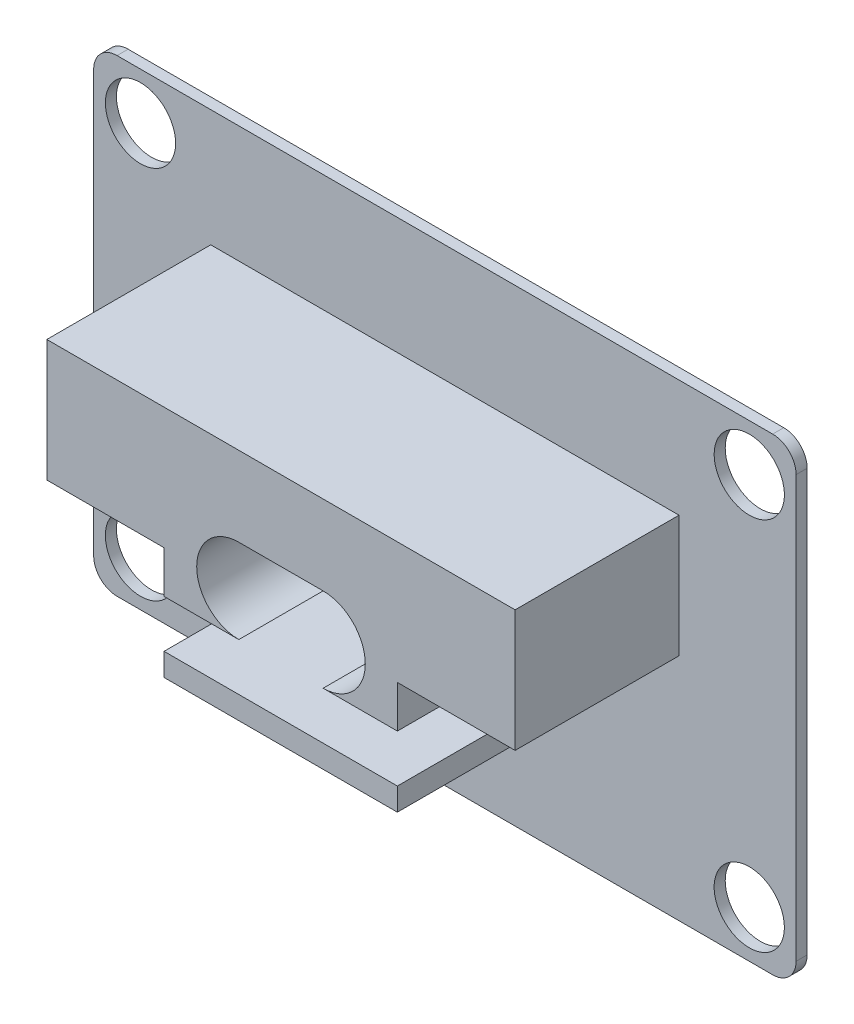
ISO-10303-21;
HEADER;
FILE_DESCRIPTION(('STEP AP214'),'2;1');
FILE_NAME('part.step','',(''),(''),'','','');
FILE_SCHEMA(('AUTOMOTIVE_DESIGN { 1 0 10303 214 1 1 1 1 }'));
ENDSEC;
DATA;
#1=APPLICATION_CONTEXT('core data for automotive mechanical design processes');
#2=APPLICATION_PROTOCOL_DEFINITION('international standard','automotive_design',2000,#1);
#3=PRODUCT_CONTEXT('',#1,'mechanical');
#4=PRODUCT('Part','Part','',(#3));
#5=PRODUCT_RELATED_PRODUCT_CATEGORY('part','',(#4));
#6=PRODUCT_DEFINITION_FORMATION('','',#4);
#7=PRODUCT_DEFINITION_CONTEXT('part definition',#1,'design');
#8=PRODUCT_DEFINITION('design','',#6,#7);
#9=PRODUCT_DEFINITION_SHAPE('','',#8);
#10=(LENGTH_UNIT() NAMED_UNIT(*) SI_UNIT(.MILLI.,.METRE.));
#11=(NAMED_UNIT(*) PLANE_ANGLE_UNIT() SI_UNIT($,.RADIAN.));
#12=(NAMED_UNIT(*) SI_UNIT($,.STERADIAN.) SOLID_ANGLE_UNIT());
#13=UNCERTAINTY_MEASURE_WITH_UNIT(LENGTH_MEASURE(1.E-05),#10,'distance_accuracy_value','');
#14=(GEOMETRIC_REPRESENTATION_CONTEXT(3) GLOBAL_UNCERTAINTY_ASSIGNED_CONTEXT((#13)) GLOBAL_UNIT_ASSIGNED_CONTEXT((#10,
#11,#12)) REPRESENTATION_CONTEXT('',''));
#15=CARTESIAN_POINT('',(0.,0.,0.));
#16=DIRECTION('',(0.,0.,1.));
#17=DIRECTION('',(1.,0.,0.));
#18=AXIS2_PLACEMENT_3D('',#15,#16,#17);
#19=CARTESIAN_POINT('',(0.,0.,0.6));
#20=DIRECTION('',(0.,0.,-1.));
#21=DIRECTION('',(-1.,0.,0.));
#22=AXIS2_PLACEMENT_3D('',#19,#20,#21);
#23=PLANE('',#22);
#24=CARTESIAN_POINT('',(2.54,22.86,0.6));
#25=DIRECTION('',(0.,0.,1.));
#26=DIRECTION('',(1.,0.,0.));
#27=AXIS2_PLACEMENT_3D('',#24,#25,#26);
#28=CIRCLE('',#27,1.905);
#29=CARTESIAN_POINT('',(4.445,22.86,0.6));
#30=VERTEX_POINT('',#29);
#31=EDGE_CURVE('E809',#30,#30,#28,.T.);
#32=ORIENTED_EDGE('',*,*,#31,.F.);
#33=EDGE_LOOP('',(#32));
#34=FACE_BOUND('',#33,.T.);
#35=CARTESIAN_POINT('',(35.56,22.86,0.6));
#36=DIRECTION('',(0.,0.,-1.));
#37=DIRECTION('',(-1.,0.,0.));
#38=AXIS2_PLACEMENT_3D('',#35,#36,#37);
#39=CIRCLE('',#38,1.905);
#40=CARTESIAN_POINT('',(33.655,22.86,0.6));
#41=VERTEX_POINT('',#40);
#42=EDGE_CURVE('E807',#41,#41,#39,.T.);
#43=ORIENTED_EDGE('',*,*,#42,.T.);
#44=EDGE_LOOP('',(#43));
#45=FACE_BOUND('',#44,.T.);
#46=CARTESIAN_POINT('',(2.54,2.54,0.6));
#47=DIRECTION('',(0.,0.,-1.));
#48=DIRECTION('',(-1.,0.,0.));
#49=AXIS2_PLACEMENT_3D('',#46,#47,#48);
#50=CIRCLE('',#49,1.905);
#51=CARTESIAN_POINT('',(0.635000000000001,2.54,0.6));
#52=VERTEX_POINT('',#51);
#53=EDGE_CURVE('E230',#52,#52,#50,.T.);
#54=ORIENTED_EDGE('',*,*,#53,.T.);
#55=EDGE_LOOP('',(#54));
#56=FACE_BOUND('',#55,.T.);
#57=DIRECTION('',(0.,1.,0.));
#58=VECTOR('',#57,1.);
#59=CARTESIAN_POINT('',(31.75,19.05,0.6));
#60=LINE('',#59,#58);
#61=CARTESIAN_POINT('',(31.75,12.446,0.6));
#62=VERTEX_POINT('',#61);
#63=CARTESIAN_POINT('',(31.75,19.05,0.6));
#64=VERTEX_POINT('',#63);
#65=EDGE_CURVE('E318',#62,#64,#60,.T.);
#66=ORIENTED_EDGE('',*,*,#65,.F.);
#67=DIRECTION('',(-1.,0.,0.));
#68=VECTOR('',#67,1.);
#69=CARTESIAN_POINT('',(0.,12.446,0.6));
#70=LINE('',#69,#68);
#71=CARTESIAN_POINT('',(25.3620799221039,12.446,0.6));
#72=VERTEX_POINT('',#71);
#73=EDGE_CURVE('E222',#62,#72,#70,.T.);
#74=ORIENTED_EDGE('',*,*,#73,.T.);
#75=DIRECTION('',(0.,-1.,0.));
#76=VECTOR('',#75,1.);
#77=CARTESIAN_POINT('',(25.3620799221039,0.,0.6));
#78=LINE('',#77,#76);
#79=CARTESIAN_POINT('',(25.3620799221039,10.16,0.6));
#80=VERTEX_POINT('',#79);
#81=EDGE_CURVE('E235',#72,#80,#78,.T.);
#82=ORIENTED_EDGE('',*,*,#81,.T.);
#83=DIRECTION('',(-1.,0.,0.));
#84=VECTOR('',#83,1.);
#85=CARTESIAN_POINT('',(0.,10.16,0.6));
#86=LINE('',#85,#84);
#87=CARTESIAN_POINT('',(21.336,10.16,0.6));
#88=VERTEX_POINT('',#87);
#89=EDGE_CURVE('E239',#80,#88,#86,.T.);
#90=ORIENTED_EDGE('',*,*,#89,.T.);
#91=CARTESIAN_POINT('',(16.764,10.16,0.6));
#92=VERTEX_POINT('',#91);
#93=EDGE_CURVE('E243',#88,#92,#86,.T.);
#94=ORIENTED_EDGE('',*,*,#93,.T.);
#95=CARTESIAN_POINT('',(12.7070511537113,10.16,0.6));
#96=VERTEX_POINT('',#95);
#97=EDGE_CURVE('E238',#92,#96,#86,.T.);
#98=ORIENTED_EDGE('',*,*,#97,.T.);
#99=DIRECTION('',(0.,1.,0.));
#100=VECTOR('',#99,1.);
#101=CARTESIAN_POINT('',(12.7070511537113,0.,0.6));
#102=LINE('',#101,#100);
#103=CARTESIAN_POINT('',(12.7070511537113,12.446,0.6));
#104=VERTEX_POINT('',#103);
#105=EDGE_CURVE('E242',#96,#104,#102,.T.);
#106=ORIENTED_EDGE('',*,*,#105,.T.);
#107=DIRECTION('',(-1.,0.,0.));
#108=VECTOR('',#107,1.);
#109=CARTESIAN_POINT('',(0.,12.446,0.6));
#110=LINE('',#109,#108);
#111=CARTESIAN_POINT('',(6.35,12.446,0.6));
#112=VERTEX_POINT('',#111);
#113=EDGE_CURVE('E246',#104,#112,#110,.T.);
#114=ORIENTED_EDGE('',*,*,#113,.T.);
#115=DIRECTION('',(0.,-1.,0.));
#116=VECTOR('',#115,1.);
#117=CARTESIAN_POINT('',(6.35,19.05,0.6));
#118=LINE('',#117,#116);
#119=CARTESIAN_POINT('',(6.35,19.05,0.6));
#120=VERTEX_POINT('',#119);
#121=EDGE_CURVE('E335',#120,#112,#118,.T.);
#122=ORIENTED_EDGE('',*,*,#121,.F.);
#123=DIRECTION('',(-1.,0.,0.));
#124=VECTOR('',#123,1.);
#125=CARTESIAN_POINT('',(31.75,19.05,0.6));
#126=LINE('',#125,#124);
#127=EDGE_CURVE('E332',#64,#120,#126,.T.);
#128=ORIENTED_EDGE('',*,*,#127,.F.);
#129=EDGE_LOOP('',(#66,#74,#82,#90,#94,#98,#106,#114,#122,#128));
#130=FACE_BOUND('',#129,.T.);
#131=DIRECTION('',(1.,0.,0.));
#132=VECTOR('',#131,1.);
#133=CARTESIAN_POINT('',(31.75,6.35,0.6));
#134=LINE('',#133,#132);
#135=CARTESIAN_POINT('',(12.7070511537113,6.35,0.6));
#136=VERTEX_POINT('',#135);
#137=CARTESIAN_POINT('',(25.3620799221039,6.35,0.6));
#138=VERTEX_POINT('',#137);
#139=EDGE_CURVE('E322',#136,#138,#134,.T.);
#140=ORIENTED_EDGE('',*,*,#139,.F.);
#141=DIRECTION('',(0.,1.,0.));
#142=VECTOR('',#141,1.);
#143=CARTESIAN_POINT('',(12.7070511537113,0.,0.6));
#144=LINE('',#143,#142);
#145=CARTESIAN_POINT('',(12.7070511537113,7.5792344782073,0.6));
#146=VERTEX_POINT('',#145);
#147=EDGE_CURVE('E213',#136,#146,#144,.T.);
#148=ORIENTED_EDGE('',*,*,#147,.T.);
#149=DIRECTION('',(1.,0.,0.));
#150=VECTOR('',#149,1.);
#151=CARTESIAN_POINT('',(0.,7.5792344782073,0.6));
#152=LINE('',#151,#150);
#153=CARTESIAN_POINT('',(25.3620799221039,7.5792344782073,0.6));
#154=VERTEX_POINT('',#153);
#155=EDGE_CURVE('E206',#146,#154,#152,.T.);
#156=ORIENTED_EDGE('',*,*,#155,.T.);
#157=DIRECTION('',(0.,-1.,0.));
#158=VECTOR('',#157,1.);
#159=CARTESIAN_POINT('',(25.3620799221039,0.,0.6));
#160=LINE('',#159,#158);
#161=EDGE_CURVE('E216',#154,#138,#160,.T.);
#162=ORIENTED_EDGE('',*,*,#161,.T.);
#163=EDGE_LOOP('',(#140,#148,#156,#162));
#164=FACE_BOUND('',#163,.T.);
#165=DIRECTION('',(1.,0.,0.));
#166=VECTOR('',#165,1.);
#167=CARTESIAN_POINT('',(0.,0.,0.6));
#168=LINE('',#167,#166);
#169=CARTESIAN_POINT('',(1.27,0.,0.6));
#170=VERTEX_POINT('',#169);
#171=CARTESIAN_POINT('',(36.83,0.,0.6));
#172=VERTEX_POINT('',#171);
#173=EDGE_CURVE('E353',#170,#172,#168,.T.);
#174=ORIENTED_EDGE('',*,*,#173,.T.);
#175=CARTESIAN_POINT('',(36.83,1.27,0.6));
#176=DIRECTION('',(0.,0.,-1.));
#177=DIRECTION('',(-1.,0.,0.));
#178=AXIS2_PLACEMENT_3D('',#175,#176,#177);
#179=CIRCLE('',#178,1.27);
#180=CARTESIAN_POINT('',(38.1,1.27,0.6));
#181=VERTEX_POINT('',#180);
#182=EDGE_CURVE('E400',#172,#181,#179,.F.);
#183=ORIENTED_EDGE('',*,*,#182,.T.);
#184=DIRECTION('',(0.,1.,0.));
#185=VECTOR('',#184,1.);
#186=CARTESIAN_POINT('',(38.1,0.,0.6));
#187=LINE('',#186,#185);
#188=CARTESIAN_POINT('',(38.1,24.13,0.6));
#189=VERTEX_POINT('',#188);
#190=EDGE_CURVE('E351',#181,#189,#187,.T.);
#191=ORIENTED_EDGE('',*,*,#190,.T.);
#192=CARTESIAN_POINT('',(36.83,24.13,0.6));
#193=DIRECTION('',(0.,0.,-1.));
#194=DIRECTION('',(-1.,0.,0.));
#195=AXIS2_PLACEMENT_3D('',#192,#193,#194);
#196=CIRCLE('',#195,1.27);
#197=CARTESIAN_POINT('',(36.83,25.4,0.6));
#198=VERTEX_POINT('',#197);
#199=EDGE_CURVE('E50',#189,#198,#196,.F.);
#200=ORIENTED_EDGE('',*,*,#199,.T.);
#201=DIRECTION('',(1.,0.,0.));
#202=VECTOR('',#201,1.);
#203=CARTESIAN_POINT('',(0.,25.4,0.6));
#204=LINE('',#203,#202);
#205=CARTESIAN_POINT('',(1.27,25.4,0.6));
#206=VERTEX_POINT('',#205);
#207=EDGE_CURVE('E348',#206,#198,#204,.T.);
#208=ORIENTED_EDGE('',*,*,#207,.F.);
#209=CARTESIAN_POINT('',(1.27,24.13,0.6));
#210=DIRECTION('',(0.,0.,-1.));
#211=DIRECTION('',(-1.,0.,0.));
#212=AXIS2_PLACEMENT_3D('',#209,#210,#211);
#213=CIRCLE('',#212,1.27);
#214=CARTESIAN_POINT('',(0.,24.13,0.6));
#215=VERTEX_POINT('',#214);
#216=EDGE_CURVE('E396',#206,#215,#213,.F.);
#217=ORIENTED_EDGE('',*,*,#216,.T.);
#218=DIRECTION('',(0.,1.,0.));
#219=VECTOR('',#218,1.);
#220=CARTESIAN_POINT('',(0.,0.,0.6));
#221=LINE('',#220,#219);
#222=CARTESIAN_POINT('',(0.,1.27,0.6));
#223=VERTEX_POINT('',#222);
#224=EDGE_CURVE('E345',#223,#215,#221,.T.);
#225=ORIENTED_EDGE('',*,*,#224,.F.);
#226=CARTESIAN_POINT('',(1.27,1.27,0.6));
#227=DIRECTION('',(0.,0.,-1.));
#228=DIRECTION('',(-1.,0.,0.));
#229=AXIS2_PLACEMENT_3D('',#226,#227,#228);
#230=CIRCLE('',#229,1.27);
#231=EDGE_CURVE('E398',#223,#170,#230,.F.);
#232=ORIENTED_EDGE('',*,*,#231,.T.);
#233=EDGE_LOOP('',(#174,#183,#191,#200,#208,#217,#225,#232));
#234=FACE_BOUND('',#233,.T.);
#235=CARTESIAN_POINT('',(35.56,2.54,0.6));
#236=DIRECTION('',(0.,0.,1.));
#237=DIRECTION('',(1.,0.,0.));
#238=AXIS2_PLACEMENT_3D('',#235,#236,#237);
#239=CIRCLE('',#238,1.905);
#240=CARTESIAN_POINT('',(37.465,2.54,0.6));
#241=VERTEX_POINT('',#240);
#242=EDGE_CURVE('E813',#241,#241,#239,.T.);
#243=ORIENTED_EDGE('',*,*,#242,.F.);
#244=EDGE_LOOP('',(#243));
#245=FACE_BOUND('',#244,.T.);
#246=ADVANCED_FACE('F35',(#34,#45,#56,#130,#164,#234,#245),#23,.F.);
#247=CARTESIAN_POINT('',(0.,0.,0.));
#248=DIRECTION('',(0.,0.,-1.));
#249=DIRECTION('',(-1.,0.,0.));
#250=AXIS2_PLACEMENT_3D('',#247,#248,#249);
#251=PLANE('',#250);
#252=CARTESIAN_POINT('',(35.56,22.86,0.));
#253=DIRECTION('',(0.,0.,-1.));
#254=DIRECTION('',(-1.,0.,0.));
#255=AXIS2_PLACEMENT_3D('',#252,#253,#254);
#256=CIRCLE('',#255,1.905);
#257=CARTESIAN_POINT('',(33.655,22.86,0.));
#258=VERTEX_POINT('',#257);
#259=EDGE_CURVE('E370',#258,#258,#256,.F.);
#260=ORIENTED_EDGE('',*,*,#259,.T.);
#261=EDGE_LOOP('',(#260));
#262=FACE_BOUND('',#261,.T.);
#263=CARTESIAN_POINT('',(2.54,2.54,0.));
#264=DIRECTION('',(0.,0.,-1.));
#265=DIRECTION('',(-1.,0.,0.));
#266=AXIS2_PLACEMENT_3D('',#263,#264,#265);
#267=CIRCLE('',#266,1.905);
#268=CARTESIAN_POINT('',(0.635000000000001,2.54,0.));
#269=VERTEX_POINT('',#268);
#270=EDGE_CURVE('E367',#269,#269,#267,.F.);
#271=ORIENTED_EDGE('',*,*,#270,.T.);
#272=EDGE_LOOP('',(#271));
#273=FACE_BOUND('',#272,.T.);
#274=DIRECTION('',(-1.,0.,0.));
#275=VECTOR('',#274,1.);
#276=CARTESIAN_POINT('',(0.,10.16,0.));
#277=LINE('',#276,#275);
#278=CARTESIAN_POINT('',(21.336,10.16,0.));
#279=VERTEX_POINT('',#278);
#280=CARTESIAN_POINT('',(16.764,10.16,0.));
#281=VERTEX_POINT('',#280);
#282=EDGE_CURVE('E316',#279,#281,#277,.T.);
#283=ORIENTED_EDGE('',*,*,#282,.F.);
#284=CARTESIAN_POINT('',(21.336,12.446,0.));
#285=DIRECTION('',(0.,0.,-1.));
#286=DIRECTION('',(-1.,0.,0.));
#287=AXIS2_PLACEMENT_3D('',#284,#285,#286);
#288=CIRCLE('',#287,2.286);
#289=CARTESIAN_POINT('',(21.336,14.732,0.));
#290=VERTEX_POINT('',#289);
#291=EDGE_CURVE('E302',#290,#279,#288,.T.);
#292=ORIENTED_EDGE('',*,*,#291,.F.);
#293=DIRECTION('',(-1.,0.,0.));
#294=VECTOR('',#293,1.);
#295=CARTESIAN_POINT('',(0.,14.732,0.));
#296=LINE('',#295,#294);
#297=CARTESIAN_POINT('',(16.764,14.732,0.));
#298=VERTEX_POINT('',#297);
#299=EDGE_CURVE('E311',#290,#298,#296,.T.);
#300=ORIENTED_EDGE('',*,*,#299,.T.);
#301=CARTESIAN_POINT('',(16.764,12.446,0.));
#302=DIRECTION('',(0.,0.,-1.));
#303=DIRECTION('',(-1.,0.,0.));
#304=AXIS2_PLACEMENT_3D('',#301,#302,#303);
#305=CIRCLE('',#304,2.286);
#306=EDGE_CURVE('E314',#281,#298,#305,.T.);
#307=ORIENTED_EDGE('',*,*,#306,.F.);
#308=EDGE_LOOP('',(#283,#292,#300,#307));
#309=FACE_BOUND('',#308,.T.);
#310=DIRECTION('',(0.,1.,0.));
#311=VECTOR('',#310,1.);
#312=CARTESIAN_POINT('',(38.1,0.,0.));
#313=LINE('',#312,#311);
#314=CARTESIAN_POINT('',(38.1,1.27,0.));
#315=VERTEX_POINT('',#314);
#316=CARTESIAN_POINT('',(38.1,24.13,0.));
#317=VERTEX_POINT('',#316);
#318=EDGE_CURVE('E362',#315,#317,#313,.T.);
#319=ORIENTED_EDGE('',*,*,#318,.F.);
#320=CARTESIAN_POINT('',(36.83,1.27,0.));
#321=DIRECTION('',(0.,0.,-1.));
#322=DIRECTION('',(-1.,0.,0.));
#323=AXIS2_PLACEMENT_3D('',#320,#321,#322);
#324=CIRCLE('',#323,1.27);
#325=CARTESIAN_POINT('',(36.83,0.,0.));
#326=VERTEX_POINT('',#325);
#327=EDGE_CURVE('E388',#315,#326,#324,.T.);
#328=ORIENTED_EDGE('',*,*,#327,.T.);
#329=DIRECTION('',(1.,0.,0.));
#330=VECTOR('',#329,1.);
#331=CARTESIAN_POINT('',(0.,0.,0.));
#332=LINE('',#331,#330);
#333=CARTESIAN_POINT('',(1.27,0.,0.));
#334=VERTEX_POINT('',#333);
#335=EDGE_CURVE('E349',#334,#326,#332,.T.);
#336=ORIENTED_EDGE('',*,*,#335,.F.);
#337=CARTESIAN_POINT('',(1.27,1.27,0.));
#338=DIRECTION('',(0.,0.,-1.));
#339=DIRECTION('',(-1.,0.,0.));
#340=AXIS2_PLACEMENT_3D('',#337,#338,#339);
#341=CIRCLE('',#340,1.27);
#342=CARTESIAN_POINT('',(0.,1.27,0.));
#343=VERTEX_POINT('',#342);
#344=EDGE_CURVE('E386',#334,#343,#341,.T.);
#345=ORIENTED_EDGE('',*,*,#344,.T.);
#346=DIRECTION('',(0.,1.,0.));
#347=VECTOR('',#346,1.);
#348=CARTESIAN_POINT('',(0.,0.,0.));
#349=LINE('',#348,#347);
#350=CARTESIAN_POINT('',(0.,24.13,0.));
#351=VERTEX_POINT('',#350);
#352=EDGE_CURVE('E344',#343,#351,#349,.T.);
#353=ORIENTED_EDGE('',*,*,#352,.T.);
#354=CARTESIAN_POINT('',(1.27,24.13,0.));
#355=DIRECTION('',(0.,0.,-1.));
#356=DIRECTION('',(-1.,0.,0.));
#357=AXIS2_PLACEMENT_3D('',#354,#355,#356);
#358=CIRCLE('',#357,1.27);
#359=CARTESIAN_POINT('',(1.27,25.4,0.));
#360=VERTEX_POINT('',#359);
#361=EDGE_CURVE('E384',#351,#360,#358,.T.);
#362=ORIENTED_EDGE('',*,*,#361,.T.);
#363=DIRECTION('',(1.,0.,0.));
#364=VECTOR('',#363,1.);
#365=CARTESIAN_POINT('',(0.,25.4,0.));
#366=LINE('',#365,#364);
#367=CARTESIAN_POINT('',(36.83,25.4,0.));
#368=VERTEX_POINT('',#367);
#369=EDGE_CURVE('E359',#360,#368,#366,.T.);
#370=ORIENTED_EDGE('',*,*,#369,.T.);
#371=CARTESIAN_POINT('',(36.83,24.13,0.));
#372=DIRECTION('',(0.,0.,-1.));
#373=DIRECTION('',(-1.,0.,0.));
#374=AXIS2_PLACEMENT_3D('',#371,#372,#373);
#375=CIRCLE('',#374,1.27);
#376=EDGE_CURVE('E382',#368,#317,#375,.T.);
#377=ORIENTED_EDGE('',*,*,#376,.T.);
#378=EDGE_LOOP('',(#319,#328,#336,#345,#353,#362,#370,#377));
#379=FACE_BOUND('',#378,.T.);
#380=CARTESIAN_POINT('',(2.54,22.86,0.));
#381=DIRECTION('',(0.,0.,-1.));
#382=DIRECTION('',(-1.,0.,0.));
#383=AXIS2_PLACEMENT_3D('',#380,#381,#382);
#384=CIRCLE('',#383,1.905);
#385=CARTESIAN_POINT('',(0.635000000000001,22.86,0.));
#386=VERTEX_POINT('',#385);
#387=EDGE_CURVE('E373',#386,#386,#384,.T.);
#388=ORIENTED_EDGE('',*,*,#387,.F.);
#389=EDGE_LOOP('',(#388));
#390=FACE_BOUND('',#389,.T.);
#391=CARTESIAN_POINT('',(35.56,2.54,0.));
#392=DIRECTION('',(0.,0.,-1.));
#393=DIRECTION('',(-1.,0.,0.));
#394=AXIS2_PLACEMENT_3D('',#391,#392,#393);
#395=CIRCLE('',#394,1.905);
#396=CARTESIAN_POINT('',(33.655,2.54,0.));
#397=VERTEX_POINT('',#396);
#398=EDGE_CURVE('E252',#397,#397,#395,.T.);
#399=ORIENTED_EDGE('',*,*,#398,.F.);
#400=EDGE_LOOP('',(#399));
#401=FACE_BOUND('',#400,.T.);
#402=ADVANCED_FACE('F412',(#262,#273,#309,#379,#390,#401),#251,.T.);
#403=CARTESIAN_POINT('',(0.,0.,9.49));
#404=DIRECTION('',(0.,0.,-1.));
#405=DIRECTION('',(-1.,0.,0.));
#406=AXIS2_PLACEMENT_3D('',#403,#404,#405);
#407=PLANE('',#406);
#408=DIRECTION('',(0.,-1.,0.));
#409=VECTOR('',#408,1.);
#410=CARTESIAN_POINT('',(6.35,19.05,9.49));
#411=LINE('',#410,#409);
#412=CARTESIAN_POINT('',(6.35,19.05,9.49));
#413=VERTEX_POINT('',#412);
#414=CARTESIAN_POINT('',(6.35,12.446,9.49));
#415=VERTEX_POINT('',#414);
#416=EDGE_CURVE('E324',#413,#415,#411,.T.);
#417=ORIENTED_EDGE('',*,*,#416,.T.);
#418=DIRECTION('',(-1.,0.,0.));
#419=VECTOR('',#418,1.);
#420=CARTESIAN_POINT('',(0.,12.446,9.49));
#421=LINE('',#420,#419);
#422=CARTESIAN_POINT('',(12.7070511537113,12.446,9.49));
#423=VERTEX_POINT('',#422);
#424=EDGE_CURVE('E227',#423,#415,#421,.T.);
#425=ORIENTED_EDGE('',*,*,#424,.F.);
#426=DIRECTION('',(0.,1.,0.));
#427=VECTOR('',#426,1.);
#428=CARTESIAN_POINT('',(12.7070511537113,0.,9.49));
#429=LINE('',#428,#427);
#430=CARTESIAN_POINT('',(12.7070511537113,10.16,9.49));
#431=VERTEX_POINT('',#430);
#432=EDGE_CURVE('E263',#431,#423,#429,.T.);
#433=ORIENTED_EDGE('',*,*,#432,.F.);
#434=DIRECTION('',(-1.,0.,0.));
#435=VECTOR('',#434,1.);
#436=CARTESIAN_POINT('',(0.,10.16,9.49));
#437=LINE('',#436,#435);
#438=CARTESIAN_POINT('',(16.764,10.16,9.49));
#439=VERTEX_POINT('',#438);
#440=EDGE_CURVE('E260',#439,#431,#437,.T.);
#441=ORIENTED_EDGE('',*,*,#440,.F.);
#442=CARTESIAN_POINT('',(16.764,12.446,9.49));
#443=DIRECTION('',(0.,0.,1.));
#444=DIRECTION('',(1.,0.,0.));
#445=AXIS2_PLACEMENT_3D('',#442,#443,#444);
#446=CIRCLE('',#445,2.286);
#447=CARTESIAN_POINT('',(16.764,14.732,9.49));
#448=VERTEX_POINT('',#447);
#449=EDGE_CURVE('E295',#448,#439,#446,.T.);
#450=ORIENTED_EDGE('',*,*,#449,.F.);
#451=DIRECTION('',(1.,0.,0.));
#452=VECTOR('',#451,1.);
#453=CARTESIAN_POINT('',(0.,14.732,9.49));
#454=LINE('',#453,#452);
#455=CARTESIAN_POINT('',(21.336,14.732,9.49));
#456=VERTEX_POINT('',#455);
#457=EDGE_CURVE('E292',#448,#456,#454,.T.);
#458=ORIENTED_EDGE('',*,*,#457,.T.);
#459=CARTESIAN_POINT('',(21.336,12.446,9.49));
#460=DIRECTION('',(0.,0.,1.));
#461=DIRECTION('',(1.,0.,0.));
#462=AXIS2_PLACEMENT_3D('',#459,#460,#461);
#463=CIRCLE('',#462,2.286);
#464=CARTESIAN_POINT('',(21.336,10.16,9.49));
#465=VERTEX_POINT('',#464);
#466=EDGE_CURVE('E289',#465,#456,#463,.T.);
#467=ORIENTED_EDGE('',*,*,#466,.F.);
#468=CARTESIAN_POINT('',(25.3620799221039,10.16,9.49));
#469=VERTEX_POINT('',#468);
#470=EDGE_CURVE('E261',#469,#465,#437,.T.);
#471=ORIENTED_EDGE('',*,*,#470,.F.);
#472=DIRECTION('',(0.,-1.,0.));
#473=VECTOR('',#472,1.);
#474=CARTESIAN_POINT('',(25.3620799221039,0.,9.49));
#475=LINE('',#474,#473);
#476=CARTESIAN_POINT('',(25.3620799221039,12.446,9.49));
#477=VERTEX_POINT('',#476);
#478=EDGE_CURVE('E257',#477,#469,#475,.T.);
#479=ORIENTED_EDGE('',*,*,#478,.F.);
#480=DIRECTION('',(-1.,0.,0.));
#481=VECTOR('',#480,1.);
#482=CARTESIAN_POINT('',(0.,12.446,9.49));
#483=LINE('',#482,#481);
#484=CARTESIAN_POINT('',(31.75,12.446,9.49));
#485=VERTEX_POINT('',#484);
#486=EDGE_CURVE('E254',#485,#477,#483,.T.);
#487=ORIENTED_EDGE('',*,*,#486,.F.);
#488=DIRECTION('',(0.,1.,0.));
#489=VECTOR('',#488,1.);
#490=CARTESIAN_POINT('',(31.75,19.05,9.49));
#491=LINE('',#490,#489);
#492=CARTESIAN_POINT('',(31.75,19.05,9.49));
#493=VERTEX_POINT('',#492);
#494=EDGE_CURVE('E319',#485,#493,#491,.T.);
#495=ORIENTED_EDGE('',*,*,#494,.T.);
#496=DIRECTION('',(-1.,0.,0.));
#497=VECTOR('',#496,1.);
#498=CARTESIAN_POINT('',(31.75,19.05,9.49));
#499=LINE('',#498,#497);
#500=EDGE_CURVE('E321',#493,#413,#499,.T.);
#501=ORIENTED_EDGE('',*,*,#500,.T.);
#502=EDGE_LOOP('',(#417,#425,#433,#441,#450,#458,#467,#471,#479,#487,#495,#501));
#503=FACE_BOUND('',#502,.T.);
#504=ADVANCED_FACE('F451',(#503),#407,.F.);
#505=CARTESIAN_POINT('',(0.,10.16,-15.91));
#506=DIRECTION('',(0.,-1.,0.));
#507=DIRECTION('',(0.,0.,-1.));
#508=AXIS2_PLACEMENT_3D('',#505,#506,#507);
#509=PLANE('',#508);
#510=ORIENTED_EDGE('',*,*,#93,.F.);
#511=DIRECTION('',(0.,0.,1.));
#512=VECTOR('',#511,1.);
#513=CARTESIAN_POINT('',(21.336,10.16,-15.91));
#514=LINE('',#513,#512);
#515=EDGE_CURVE('E307',#279,#88,#514,.T.);
#516=ORIENTED_EDGE('',*,*,#515,.F.);
#517=ORIENTED_EDGE('',*,*,#282,.T.);
#518=DIRECTION('',(0.,0.,1.));
#519=VECTOR('',#518,1.);
#520=CARTESIAN_POINT('',(16.764,10.16,-15.91));
#521=LINE('',#520,#519);
#522=EDGE_CURVE('E299',#281,#92,#521,.T.);
#523=ORIENTED_EDGE('',*,*,#522,.T.);
#524=EDGE_LOOP('',(#510,#516,#517,#523));
#525=FACE_BOUND('',#524,.T.);
#526=ADVANCED_FACE('F468',(#525),#509,.F.);
#527=CARTESIAN_POINT('',(0.,0.,0.6));
#528=DIRECTION('',(-1.,0.,0.));
#529=DIRECTION('',(0.,0.,1.));
#530=AXIS2_PLACEMENT_3D('',#527,#528,#529);
#531=PLANE('',#530);
#532=ORIENTED_EDGE('',*,*,#352,.F.);
#533=DIRECTION('',(0.,0.,-1.));
#534=VECTOR('',#533,1.);
#535=CARTESIAN_POINT('',(0.,1.27,0.6));
#536=LINE('',#535,#534);
#537=EDGE_CURVE('E405',#343,#223,#536,.F.);
#538=ORIENTED_EDGE('',*,*,#537,.T.);
#539=ORIENTED_EDGE('',*,*,#224,.T.);
#540=DIRECTION('',(0.,0.,-1.));
#541=VECTOR('',#540,1.);
#542=CARTESIAN_POINT('',(0.,24.13,0.6));
#543=LINE('',#542,#541);
#544=EDGE_CURVE('E402',#215,#351,#543,.T.);
#545=ORIENTED_EDGE('',*,*,#544,.T.);
#546=EDGE_LOOP('',(#532,#538,#539,#545));
#547=FACE_BOUND('',#546,.T.);
#548=ADVANCED_FACE('F420',(#547),#531,.T.);
#549=CARTESIAN_POINT('',(0.,0.,0.6));
#550=DIRECTION('',(0.,1.,0.));
#551=DIRECTION('',(0.,0.,1.));
#552=AXIS2_PLACEMENT_3D('',#549,#550,#551);
#553=PLANE('',#552);
#554=ORIENTED_EDGE('',*,*,#335,.T.);
#555=DIRECTION('',(0.,0.,-1.));
#556=VECTOR('',#555,1.);
#557=CARTESIAN_POINT('',(36.83,0.,0.6));
#558=LINE('',#557,#556);
#559=EDGE_CURVE('E393',#326,#172,#558,.F.);
#560=ORIENTED_EDGE('',*,*,#559,.T.);
#561=ORIENTED_EDGE('',*,*,#173,.F.);
#562=DIRECTION('',(0.,0.,-1.));
#563=VECTOR('',#562,1.);
#564=CARTESIAN_POINT('',(1.27,0.,0.));
#565=LINE('',#564,#563);
#566=EDGE_CURVE('E390',#170,#334,#565,.T.);
#567=ORIENTED_EDGE('',*,*,#566,.T.);
#568=EDGE_LOOP('',(#554,#560,#561,#567));
#569=FACE_BOUND('',#568,.T.);
#570=ADVANCED_FACE('F431',(#569),#553,.F.);
#571=CARTESIAN_POINT('',(38.1,0.,0.6));
#572=DIRECTION('',(-1.,0.,0.));
#573=DIRECTION('',(0.,0.,1.));
#574=AXIS2_PLACEMENT_3D('',#571,#572,#573);
#575=PLANE('',#574);
#576=ORIENTED_EDGE('',*,*,#190,.F.);
#577=DIRECTION('',(0.,0.,-1.));
#578=VECTOR('',#577,1.);
#579=CARTESIAN_POINT('',(38.1,1.27,0.6));
#580=LINE('',#579,#578);
#581=EDGE_CURVE('E379',#181,#315,#580,.T.);
#582=ORIENTED_EDGE('',*,*,#581,.T.);
#583=ORIENTED_EDGE('',*,*,#318,.T.);
#584=DIRECTION('',(0.,0.,-1.));
#585=VECTOR('',#584,1.);
#586=CARTESIAN_POINT('',(38.1,24.13,0.6));
#587=LINE('',#586,#585);
#588=EDGE_CURVE('E356',#317,#189,#587,.F.);
#589=ORIENTED_EDGE('',*,*,#588,.T.);
#590=EDGE_LOOP('',(#576,#582,#583,#589));
#591=FACE_BOUND('',#590,.T.);
#592=ADVANCED_FACE('F439',(#591),#575,.F.);
#593=CARTESIAN_POINT('',(0.,25.4,0.6));
#594=DIRECTION('',(0.,1.,0.));
#595=DIRECTION('',(0.,0.,1.));
#596=AXIS2_PLACEMENT_3D('',#593,#594,#595);
#597=PLANE('',#596);
#598=ORIENTED_EDGE('',*,*,#369,.F.);
#599=DIRECTION('',(0.,0.,-1.));
#600=VECTOR('',#599,1.);
#601=CARTESIAN_POINT('',(1.27,25.4,0.6));
#602=LINE('',#601,#600);
#603=EDGE_CURVE('E11',#360,#206,#602,.F.);
#604=ORIENTED_EDGE('',*,*,#603,.T.);
#605=ORIENTED_EDGE('',*,*,#207,.T.);
#606=DIRECTION('',(0.,0.,-1.));
#607=VECTOR('',#606,1.);
#608=CARTESIAN_POINT('',(36.83,25.4,0.));
#609=LINE('',#608,#607);
#610=EDGE_CURVE('E43',#198,#368,#609,.T.);
#611=ORIENTED_EDGE('',*,*,#610,.T.);
#612=EDGE_LOOP('',(#598,#604,#605,#611));
#613=FACE_BOUND('',#612,.T.);
#614=ADVANCED_FACE('F408',(#613),#597,.T.);
#615=CARTESIAN_POINT('',(31.75,19.05,9.49));
#616=DIRECTION('',(-1.,0.,0.));
#617=DIRECTION('',(0.,0.,1.));
#618=AXIS2_PLACEMENT_3D('',#615,#616,#617);
#619=PLANE('',#618);
#620=ORIENTED_EDGE('',*,*,#494,.F.);
#621=DIRECTION('',(0.,0.,1.));
#622=VECTOR('',#621,1.);
#623=CARTESIAN_POINT('',(31.75,12.446,0.6));
#624=LINE('',#623,#622);
#625=EDGE_CURVE('E284',#62,#485,#624,.T.);
#626=ORIENTED_EDGE('',*,*,#625,.F.);
#627=ORIENTED_EDGE('',*,*,#65,.T.);
#628=DIRECTION('',(0.,0.,-1.));
#629=VECTOR('',#628,1.);
#630=CARTESIAN_POINT('',(31.75,19.05,9.49));
#631=LINE('',#630,#629);
#632=EDGE_CURVE('E341',#493,#64,#631,.T.);
#633=ORIENTED_EDGE('',*,*,#632,.F.);
#634=EDGE_LOOP('',(#620,#626,#627,#633));
#635=FACE_BOUND('',#634,.T.);
#636=ADVANCED_FACE('F457',(#635),#619,.F.);
#637=CARTESIAN_POINT('',(31.75,19.05,9.49));
#638=DIRECTION('',(0.,-1.,0.));
#639=DIRECTION('',(1.,0.,0.));
#640=AXIS2_PLACEMENT_3D('',#637,#638,#639);
#641=PLANE('',#640);
#642=ORIENTED_EDGE('',*,*,#127,.T.);
#643=DIRECTION('',(0.,0.,-1.));
#644=VECTOR('',#643,1.);
#645=CARTESIAN_POINT('',(6.35,19.05,9.49));
#646=LINE('',#645,#644);
#647=EDGE_CURVE('E330',#413,#120,#646,.T.);
#648=ORIENTED_EDGE('',*,*,#647,.F.);
#649=ORIENTED_EDGE('',*,*,#500,.F.);
#650=ORIENTED_EDGE('',*,*,#632,.T.);
#651=EDGE_LOOP('',(#642,#648,#649,#650));
#652=FACE_BOUND('',#651,.T.);
#653=ADVANCED_FACE('F576',(#652),#641,.F.);
#654=CARTESIAN_POINT('',(6.35,19.05,9.49));
#655=DIRECTION('',(1.,0.,0.));
#656=DIRECTION('',(0.,0.,-1.));
#657=AXIS2_PLACEMENT_3D('',#654,#655,#656);
#658=PLANE('',#657);
#659=ORIENTED_EDGE('',*,*,#121,.T.);
#660=DIRECTION('',(0.,0.,1.));
#661=VECTOR('',#660,1.);
#662=CARTESIAN_POINT('',(6.35,12.446,0.6));
#663=LINE('',#662,#661);
#664=EDGE_CURVE('E272',#112,#415,#663,.T.);
#665=ORIENTED_EDGE('',*,*,#664,.T.);
#666=ORIENTED_EDGE('',*,*,#416,.F.);
#667=ORIENTED_EDGE('',*,*,#647,.T.);
#668=EDGE_LOOP('',(#659,#665,#666,#667));
#669=FACE_BOUND('',#668,.T.);
#670=ADVANCED_FACE('F584',(#669),#658,.F.);
#671=CARTESIAN_POINT('',(31.75,6.35,9.49));
#672=DIRECTION('',(0.,1.,0.));
#673=DIRECTION('',(-1.,0.,0.));
#674=AXIS2_PLACEMENT_3D('',#671,#672,#673);
#675=PLANE('',#674);
#676=DIRECTION('',(1.,0.,0.));
#677=VECTOR('',#676,1.);
#678=CARTESIAN_POINT('',(31.75,6.35,9.49));
#679=LINE('',#678,#677);
#680=CARTESIAN_POINT('',(12.7070511537113,6.35,9.49));
#681=VERTEX_POINT('',#680);
#682=CARTESIAN_POINT('',(25.3620799221039,6.35,9.49));
#683=VERTEX_POINT('',#682);
#684=EDGE_CURVE('E327',#681,#683,#679,.T.);
#685=ORIENTED_EDGE('',*,*,#684,.F.);
#686=DIRECTION('',(0.,0.,1.));
#687=VECTOR('',#686,1.);
#688=CARTESIAN_POINT('',(12.7070511537113,6.35,0.6));
#689=LINE('',#688,#687);
#690=EDGE_CURVE('E270',#136,#681,#689,.T.);
#691=ORIENTED_EDGE('',*,*,#690,.F.);
#692=ORIENTED_EDGE('',*,*,#139,.T.);
#693=DIRECTION('',(0.,0.,1.));
#694=VECTOR('',#693,1.);
#695=CARTESIAN_POINT('',(25.3620799221039,6.35,0.6));
#696=LINE('',#695,#694);
#697=EDGE_CURVE('E212',#138,#683,#696,.T.);
#698=ORIENTED_EDGE('',*,*,#697,.T.);
#699=EDGE_LOOP('',(#685,#691,#692,#698));
#700=FACE_BOUND('',#699,.T.);
#701=ADVANCED_FACE('F591',(#700),#675,.F.);
#702=DIRECTION('',(1.,0.,0.));
#703=VECTOR('',#702,1.);
#704=CARTESIAN_POINT('',(0.,7.5792344782073,9.49));
#705=LINE('',#704,#703);
#706=CARTESIAN_POINT('',(12.7070511537113,7.5792344782073,9.49));
#707=VERTEX_POINT('',#706);
#708=CARTESIAN_POINT('',(25.3620799221039,7.5792344782073,9.49));
#709=VERTEX_POINT('',#708);
#710=EDGE_CURVE('E209',#707,#709,#705,.T.);
#711=ORIENTED_EDGE('',*,*,#710,.F.);
#712=DIRECTION('',(0.,1.,0.));
#713=VECTOR('',#712,1.);
#714=CARTESIAN_POINT('',(12.7070511537113,0.,9.49));
#715=LINE('',#714,#713);
#716=EDGE_CURVE('E224',#681,#707,#715,.T.);
#717=ORIENTED_EDGE('',*,*,#716,.F.);
#718=ORIENTED_EDGE('',*,*,#684,.T.);
#719=DIRECTION('',(0.,-1.,0.));
#720=VECTOR('',#719,1.);
#721=CARTESIAN_POINT('',(25.3620799221039,0.,9.49));
#722=LINE('',#721,#720);
#723=EDGE_CURVE('E251',#709,#683,#722,.T.);
#724=ORIENTED_EDGE('',*,*,#723,.F.);
#725=EDGE_LOOP('',(#711,#717,#718,#724));
#726=FACE_BOUND('',#725,.T.);
#727=ADVANCED_FACE('F599',(#726),#407,.F.);
#728=CARTESIAN_POINT('',(16.764,12.446,-15.91));
#729=DIRECTION('',(0.,0.,1.));
#730=DIRECTION('',(1.,0.,0.));
#731=AXIS2_PLACEMENT_3D('',#728,#729,#730);
#732=CYLINDRICAL_SURFACE('',#731,2.286);
#733=ORIENTED_EDGE('',*,*,#306,.T.);
#734=DIRECTION('',(0.,0.,1.));
#735=VECTOR('',#734,1.);
#736=CARTESIAN_POINT('',(16.764,14.732,-15.91));
#737=LINE('',#736,#735);
#738=EDGE_CURVE('E303',#298,#448,#737,.T.);
#739=ORIENTED_EDGE('',*,*,#738,.T.);
#740=ORIENTED_EDGE('',*,*,#449,.T.);
#741=DIRECTION('',(0.,0.,1.));
#742=VECTOR('',#741,1.);
#743=CARTESIAN_POINT('',(16.764,10.16,-15.91));
#744=LINE('',#743,#742);
#745=EDGE_CURVE('E269',#439,#92,#744,.F.);
#746=ORIENTED_EDGE('',*,*,#745,.T.);
#747=ORIENTED_EDGE('',*,*,#522,.F.);
#748=EDGE_LOOP('',(#733,#739,#740,#746,#747));
#749=FACE_BOUND('',#748,.T.);
#750=ADVANCED_FACE('F607',(#749),#732,.F.);
#751=CARTESIAN_POINT('',(0.,14.732,-15.91));
#752=DIRECTION('',(0.,-1.,0.));
#753=DIRECTION('',(0.,0.,-1.));
#754=AXIS2_PLACEMENT_3D('',#751,#752,#753);
#755=PLANE('',#754);
#756=DIRECTION('',(0.,0.,1.));
#757=VECTOR('',#756,1.);
#758=CARTESIAN_POINT('',(21.336,14.732,-15.91));
#759=LINE('',#758,#757);
#760=EDGE_CURVE('E305',#290,#456,#759,.T.);
#761=ORIENTED_EDGE('',*,*,#760,.T.);
#762=ORIENTED_EDGE('',*,*,#457,.F.);
#763=ORIENTED_EDGE('',*,*,#738,.F.);
#764=ORIENTED_EDGE('',*,*,#299,.F.);
#765=EDGE_LOOP('',(#761,#762,#763,#764));
#766=FACE_BOUND('',#765,.T.);
#767=ADVANCED_FACE('F615',(#766),#755,.T.);
#768=CARTESIAN_POINT('',(21.336,12.446,-15.91));
#769=DIRECTION('',(0.,0.,1.));
#770=DIRECTION('',(1.,0.,0.));
#771=AXIS2_PLACEMENT_3D('',#768,#769,#770);
#772=CYLINDRICAL_SURFACE('',#771,2.286);
#773=ORIENTED_EDGE('',*,*,#291,.T.);
#774=ORIENTED_EDGE('',*,*,#515,.T.);
#775=EDGE_CURVE('E298',#88,#465,#514,.T.);
#776=ORIENTED_EDGE('',*,*,#775,.T.);
#777=ORIENTED_EDGE('',*,*,#466,.T.);
#778=ORIENTED_EDGE('',*,*,#760,.F.);
#779=EDGE_LOOP('',(#773,#774,#776,#777,#778));
#780=FACE_BOUND('',#779,.T.);
#781=ADVANCED_FACE('F623',(#780),#772,.F.);
#782=CARTESIAN_POINT('',(0.,10.16,0.6));
#783=DIRECTION('',(0.,1.,0.));
#784=DIRECTION('',(0.,0.,1.));
#785=AXIS2_PLACEMENT_3D('',#782,#783,#784);
#786=PLANE('',#785);
#787=ORIENTED_EDGE('',*,*,#440,.T.);
#788=DIRECTION('',(0.,0.,1.));
#789=VECTOR('',#788,1.);
#790=CARTESIAN_POINT('',(12.7070511537113,10.16,0.6));
#791=LINE('',#790,#789);
#792=EDGE_CURVE('E277',#96,#431,#791,.T.);
#793=ORIENTED_EDGE('',*,*,#792,.F.);
#794=ORIENTED_EDGE('',*,*,#97,.F.);
#795=ORIENTED_EDGE('',*,*,#745,.F.);
#796=EDGE_LOOP('',(#787,#793,#794,#795));
#797=FACE_BOUND('',#796,.T.);
#798=ADVANCED_FACE('F631',(#797),#786,.F.);
#799=CARTESIAN_POINT('',(0.,7.5792344782073,0.6));
#800=DIRECTION('',(0.,-1.,0.));
#801=DIRECTION('',(0.,0.,-1.));
#802=AXIS2_PLACEMENT_3D('',#799,#800,#801);
#803=PLANE('',#802);
#804=ORIENTED_EDGE('',*,*,#710,.T.);
#805=DIRECTION('',(0.,0.,1.));
#806=VECTOR('',#805,1.);
#807=CARTESIAN_POINT('',(25.3620799221039,7.5792344782073,0.6));
#808=LINE('',#807,#806);
#809=EDGE_CURVE('E202',#154,#709,#808,.T.);
#810=ORIENTED_EDGE('',*,*,#809,.F.);
#811=ORIENTED_EDGE('',*,*,#155,.F.);
#812=DIRECTION('',(0.,0.,1.));
#813=VECTOR('',#812,1.);
#814=CARTESIAN_POINT('',(12.7070511537113,7.5792344782073,0.6));
#815=LINE('',#814,#813);
#816=EDGE_CURVE('E267',#146,#707,#815,.T.);
#817=ORIENTED_EDGE('',*,*,#816,.T.);
#818=EDGE_LOOP('',(#804,#810,#811,#817));
#819=FACE_BOUND('',#818,.T.);
#820=ADVANCED_FACE('F204',(#819),#803,.F.);
#821=CARTESIAN_POINT('',(12.7070511537113,0.,0.6));
#822=DIRECTION('',(1.,0.,0.));
#823=DIRECTION('',(0.,0.,-1.));
#824=AXIS2_PLACEMENT_3D('',#821,#822,#823);
#825=PLANE('',#824);
#826=ORIENTED_EDGE('',*,*,#716,.T.);
#827=ORIENTED_EDGE('',*,*,#816,.F.);
#828=ORIENTED_EDGE('',*,*,#147,.F.);
#829=ORIENTED_EDGE('',*,*,#690,.T.);
#830=EDGE_LOOP('',(#826,#827,#828,#829));
#831=FACE_BOUND('',#830,.T.);
#832=ADVANCED_FACE('F647',(#831),#825,.F.);
#833=CARTESIAN_POINT('',(0.,12.446,0.6));
#834=DIRECTION('',(0.,1.,0.));
#835=DIRECTION('',(0.,0.,1.));
#836=AXIS2_PLACEMENT_3D('',#833,#834,#835);
#837=PLANE('',#836);
#838=ORIENTED_EDGE('',*,*,#424,.T.);
#839=ORIENTED_EDGE('',*,*,#664,.F.);
#840=ORIENTED_EDGE('',*,*,#113,.F.);
#841=DIRECTION('',(0.,0.,1.));
#842=VECTOR('',#841,1.);
#843=CARTESIAN_POINT('',(12.7070511537113,12.446,0.6));
#844=LINE('',#843,#842);
#845=EDGE_CURVE('E275',#104,#423,#844,.T.);
#846=ORIENTED_EDGE('',*,*,#845,.T.);
#847=EDGE_LOOP('',(#838,#839,#840,#846));
#848=FACE_BOUND('',#847,.T.);
#849=ADVANCED_FACE('F654',(#848),#837,.F.);
#850=CARTESIAN_POINT('',(12.7070511537113,0.,0.6));
#851=DIRECTION('',(1.,0.,0.));
#852=DIRECTION('',(0.,0.,-1.));
#853=AXIS2_PLACEMENT_3D('',#850,#851,#852);
#854=PLANE('',#853);
#855=ORIENTED_EDGE('',*,*,#432,.T.);
#856=ORIENTED_EDGE('',*,*,#845,.F.);
#857=ORIENTED_EDGE('',*,*,#105,.F.);
#858=ORIENTED_EDGE('',*,*,#792,.T.);
#859=EDGE_LOOP('',(#855,#856,#857,#858));
#860=FACE_BOUND('',#859,.T.);
#861=ADVANCED_FACE('F662',(#860),#854,.F.);
#862=ORIENTED_EDGE('',*,*,#775,.F.);
#863=ORIENTED_EDGE('',*,*,#89,.F.);
#864=DIRECTION('',(0.,0.,1.));
#865=VECTOR('',#864,1.);
#866=CARTESIAN_POINT('',(25.3620799221039,10.16,0.6));
#867=LINE('',#866,#865);
#868=EDGE_CURVE('E280',#80,#469,#867,.T.);
#869=ORIENTED_EDGE('',*,*,#868,.T.);
#870=ORIENTED_EDGE('',*,*,#470,.T.);
#871=EDGE_LOOP('',(#862,#863,#869,#870));
#872=FACE_BOUND('',#871,.T.);
#873=ADVANCED_FACE('F641',(#872),#786,.F.);
#874=CARTESIAN_POINT('',(25.3620799221039,0.,0.6));
#875=DIRECTION('',(-1.,0.,0.));
#876=DIRECTION('',(0.,0.,1.));
#877=AXIS2_PLACEMENT_3D('',#874,#875,#876);
#878=PLANE('',#877);
#879=ORIENTED_EDGE('',*,*,#478,.T.);
#880=ORIENTED_EDGE('',*,*,#868,.F.);
#881=ORIENTED_EDGE('',*,*,#81,.F.);
#882=DIRECTION('',(0.,0.,1.));
#883=VECTOR('',#882,1.);
#884=CARTESIAN_POINT('',(25.3620799221039,12.446,0.6));
#885=LINE('',#884,#883);
#886=EDGE_CURVE('E282',#72,#477,#885,.T.);
#887=ORIENTED_EDGE('',*,*,#886,.T.);
#888=EDGE_LOOP('',(#879,#880,#881,#887));
#889=FACE_BOUND('',#888,.T.);
#890=ADVANCED_FACE('F677',(#889),#878,.F.);
#891=CARTESIAN_POINT('',(0.,12.446,0.6));
#892=DIRECTION('',(0.,1.,0.));
#893=DIRECTION('',(0.,0.,1.));
#894=AXIS2_PLACEMENT_3D('',#891,#892,#893);
#895=PLANE('',#894);
#896=ORIENTED_EDGE('',*,*,#486,.T.);
#897=ORIENTED_EDGE('',*,*,#886,.F.);
#898=ORIENTED_EDGE('',*,*,#73,.F.);
#899=ORIENTED_EDGE('',*,*,#625,.T.);
#900=EDGE_LOOP('',(#896,#897,#898,#899));
#901=FACE_BOUND('',#900,.T.);
#902=ADVANCED_FACE('F684',(#901),#895,.F.);
#903=CARTESIAN_POINT('',(25.3620799221039,0.,0.6));
#904=DIRECTION('',(-1.,0.,0.));
#905=DIRECTION('',(0.,0.,1.));
#906=AXIS2_PLACEMENT_3D('',#903,#904,#905);
#907=PLANE('',#906);
#908=ORIENTED_EDGE('',*,*,#723,.T.);
#909=ORIENTED_EDGE('',*,*,#697,.F.);
#910=ORIENTED_EDGE('',*,*,#161,.F.);
#911=ORIENTED_EDGE('',*,*,#809,.T.);
#912=EDGE_LOOP('',(#908,#909,#910,#911));
#913=FACE_BOUND('',#912,.T.);
#914=ADVANCED_FACE('F217',(#913),#907,.F.);
#915=CARTESIAN_POINT('',(2.54,2.54,-4.48));
#916=DIRECTION('',(0.,0.,1.));
#917=DIRECTION('',(1.,0.,0.));
#918=AXIS2_PLACEMENT_3D('',#915,#916,#917);
#919=CYLINDRICAL_SURFACE('',#918,1.905);
#920=ORIENTED_EDGE('',*,*,#270,.F.);
#921=EDGE_LOOP('',(#920));
#922=FACE_BOUND('',#921,.T.);
#923=ORIENTED_EDGE('',*,*,#53,.F.);
#924=EDGE_LOOP('',(#923));
#925=FACE_BOUND('',#924,.T.);
#926=ADVANCED_FACE('F520',(#922,#925),#919,.F.);
#927=CARTESIAN_POINT('',(35.56,22.86,-4.48));
#928=DIRECTION('',(0.,0.,1.));
#929=DIRECTION('',(1.,0.,0.));
#930=AXIS2_PLACEMENT_3D('',#927,#928,#929);
#931=CYLINDRICAL_SURFACE('',#930,1.905);
#932=ORIENTED_EDGE('',*,*,#259,.F.);
#933=EDGE_LOOP('',(#932));
#934=FACE_BOUND('',#933,.T.);
#935=ORIENTED_EDGE('',*,*,#42,.F.);
#936=EDGE_LOOP('',(#935));
#937=FACE_BOUND('',#936,.T.);
#938=ADVANCED_FACE('F511',(#934,#937),#931,.F.);
#939=CARTESIAN_POINT('',(2.54,22.86,-4.48));
#940=DIRECTION('',(0.,0.,1.));
#941=DIRECTION('',(1.,0.,0.));
#942=AXIS2_PLACEMENT_3D('',#939,#940,#941);
#943=CYLINDRICAL_SURFACE('',#942,1.905);
#944=ORIENTED_EDGE('',*,*,#387,.T.);
#945=EDGE_LOOP('',(#944));
#946=FACE_BOUND('',#945,.T.);
#947=ORIENTED_EDGE('',*,*,#31,.T.);
#948=EDGE_LOOP('',(#947));
#949=FACE_BOUND('',#948,.T.);
#950=ADVANCED_FACE('F502',(#946,#949),#943,.F.);
#951=CARTESIAN_POINT('',(35.56,2.54,-4.48));
#952=DIRECTION('',(0.,0.,1.));
#953=DIRECTION('',(1.,0.,0.));
#954=AXIS2_PLACEMENT_3D('',#951,#952,#953);
#955=CYLINDRICAL_SURFACE('',#954,1.905);
#956=ORIENTED_EDGE('',*,*,#398,.T.);
#957=EDGE_LOOP('',(#956));
#958=FACE_BOUND('',#957,.T.);
#959=ORIENTED_EDGE('',*,*,#242,.T.);
#960=EDGE_LOOP('',(#959));
#961=FACE_BOUND('',#960,.T.);
#962=ADVANCED_FACE('F471',(#958,#961),#955,.F.);
#963=CARTESIAN_POINT('',(36.83,1.27,0.6));
#964=DIRECTION('',(0.,0.,-1.));
#965=DIRECTION('',(-1.,0.,0.));
#966=AXIS2_PLACEMENT_3D('',#963,#964,#965);
#967=CYLINDRICAL_SURFACE('',#966,1.27);
#968=ORIENTED_EDGE('',*,*,#182,.F.);
#969=ORIENTED_EDGE('',*,*,#559,.F.);
#970=ORIENTED_EDGE('',*,*,#327,.F.);
#971=ORIENTED_EDGE('',*,*,#581,.F.);
#972=EDGE_LOOP('',(#968,#969,#970,#971));
#973=FACE_BOUND('',#972,.T.);
#974=ADVANCED_FACE('F436',(#973),#967,.T.);
#975=CARTESIAN_POINT('',(1.27,1.27,0.6));
#976=DIRECTION('',(0.,0.,1.));
#977=DIRECTION('',(1.,0.,0.));
#978=AXIS2_PLACEMENT_3D('',#975,#976,#977);
#979=CYLINDRICAL_SURFACE('',#978,1.27);
#980=ORIENTED_EDGE('',*,*,#231,.F.);
#981=ORIENTED_EDGE('',*,*,#537,.F.);
#982=ORIENTED_EDGE('',*,*,#344,.F.);
#983=ORIENTED_EDGE('',*,*,#566,.F.);
#984=EDGE_LOOP('',(#980,#981,#982,#983));
#985=FACE_BOUND('',#984,.T.);
#986=ADVANCED_FACE('F428',(#985),#979,.T.);
#987=CARTESIAN_POINT('',(1.27,24.13,0.6));
#988=DIRECTION('',(0.,0.,-1.));
#989=DIRECTION('',(-1.,0.,0.));
#990=AXIS2_PLACEMENT_3D('',#987,#988,#989);
#991=CYLINDRICAL_SURFACE('',#990,1.27);
#992=ORIENTED_EDGE('',*,*,#216,.F.);
#993=ORIENTED_EDGE('',*,*,#603,.F.);
#994=ORIENTED_EDGE('',*,*,#361,.F.);
#995=ORIENTED_EDGE('',*,*,#544,.F.);
#996=EDGE_LOOP('',(#992,#993,#994,#995));
#997=FACE_BOUND('',#996,.T.);
#998=ADVANCED_FACE('F418',(#997),#991,.T.);
#999=CARTESIAN_POINT('',(36.83,24.13,0.6));
#1000=DIRECTION('',(0.,0.,1.));
#1001=DIRECTION('',(1.,0.,0.));
#1002=AXIS2_PLACEMENT_3D('',#999,#1000,#1001);
#1003=CYLINDRICAL_SURFACE('',#1002,1.27);
#1004=ORIENTED_EDGE('',*,*,#199,.F.);
#1005=ORIENTED_EDGE('',*,*,#588,.F.);
#1006=ORIENTED_EDGE('',*,*,#376,.F.);
#1007=ORIENTED_EDGE('',*,*,#610,.F.);
#1008=EDGE_LOOP('',(#1004,#1005,#1006,#1007));
#1009=FACE_BOUND('',#1008,.T.);
#1010=ADVANCED_FACE('F37',(#1009),#1003,.T.);
#1011=CLOSED_SHELL('',(#246,#402,#504,#526,#548,#570,#592,#614,#636,#653,#670,#701,#727,#750,
#767,#781,#798,#820,#832,#849,#861,#873,#890,#902,#914,#926,#938,#950,#962,#974,#986,#998,#1010));
#1012=MANIFOLD_SOLID_BREP('B2',#1011);
#1013=ADVANCED_BREP_SHAPE_REPRESENTATION('',(#18,#1012),#14);
#1014=SHAPE_DEFINITION_REPRESENTATION(#9,#1013);
ENDSEC;
END-ISO-10303-21;
